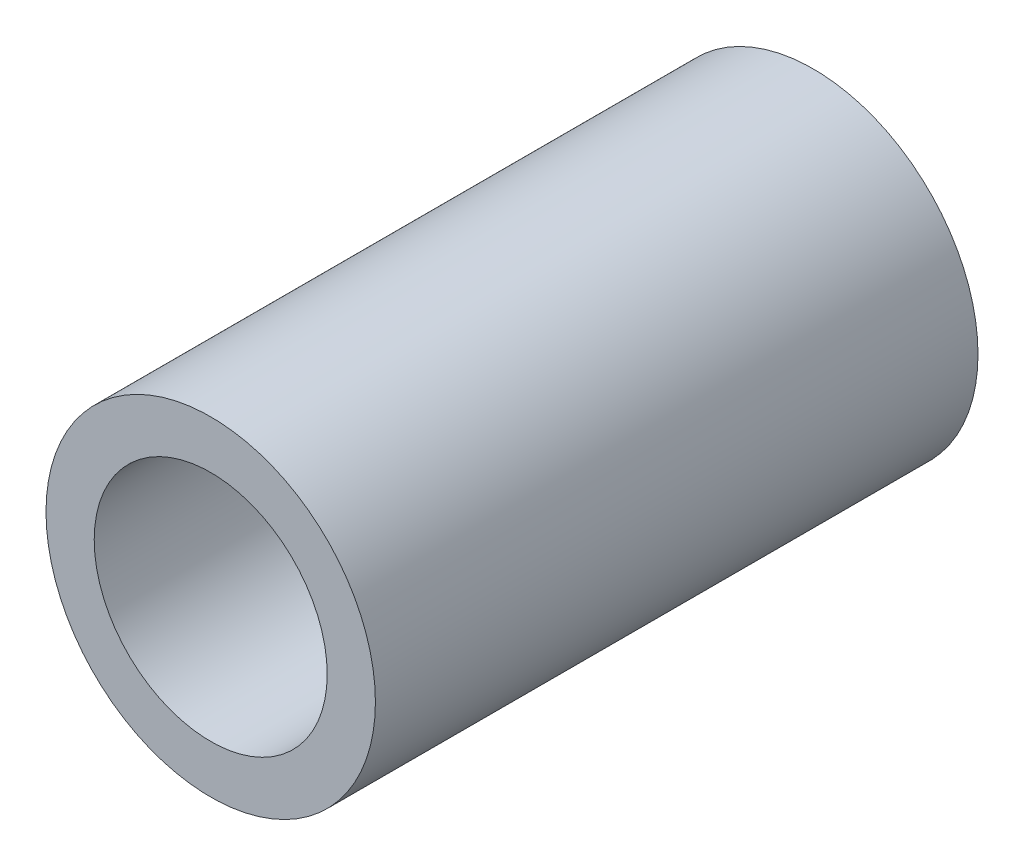
ISO-10303-21;
HEADER;
FILE_DESCRIPTION(('STEP AP214'),'2;1');
FILE_NAME('part.step','',(''),(''),'','','');
FILE_SCHEMA(('AUTOMOTIVE_DESIGN { 1 0 10303 214 1 1 1 1 }'));
ENDSEC;
DATA;
#1=APPLICATION_CONTEXT('core data for automotive mechanical design processes');
#2=APPLICATION_PROTOCOL_DEFINITION('international standard','automotive_design',2000,#1);
#3=PRODUCT_CONTEXT('',#1,'mechanical');
#4=PRODUCT('Part','Part','',(#3));
#5=PRODUCT_RELATED_PRODUCT_CATEGORY('part','',(#4));
#6=PRODUCT_DEFINITION_FORMATION('','',#4);
#7=PRODUCT_DEFINITION_CONTEXT('part definition',#1,'design');
#8=PRODUCT_DEFINITION('design','',#6,#7);
#9=PRODUCT_DEFINITION_SHAPE('','',#8);
#10=(LENGTH_UNIT() NAMED_UNIT(*) SI_UNIT(.MILLI.,.METRE.));
#11=(NAMED_UNIT(*) PLANE_ANGLE_UNIT() SI_UNIT($,.RADIAN.));
#12=(NAMED_UNIT(*) SI_UNIT($,.STERADIAN.) SOLID_ANGLE_UNIT());
#13=UNCERTAINTY_MEASURE_WITH_UNIT(LENGTH_MEASURE(1.E-05),#10,'distance_accuracy_value','');
#14=(GEOMETRIC_REPRESENTATION_CONTEXT(3) GLOBAL_UNCERTAINTY_ASSIGNED_CONTEXT((#13)) GLOBAL_UNIT_ASSIGNED_CONTEXT((#10,
#11,#12)) REPRESENTATION_CONTEXT('',''));
#15=CARTESIAN_POINT('',(0.,0.,0.));
#16=DIRECTION('',(0.,0.,1.));
#17=DIRECTION('',(1.,0.,0.));
#18=AXIS2_PLACEMENT_3D('',#15,#16,#17);
#19=CARTESIAN_POINT('',(0.,0.,7.5));
#20=DIRECTION('',(0.,0.,1.));
#21=DIRECTION('',(1.,0.,0.));
#22=AXIS2_PLACEMENT_3D('',#19,#20,#21);
#23=PLANE('',#22);
#24=CARTESIAN_POINT('',(0.,0.,7.5));
#25=DIRECTION('',(0.,0.,1.));
#26=DIRECTION('',(1.,0.,0.));
#27=AXIS2_PLACEMENT_3D('',#24,#25,#26);
#28=CIRCLE('',#27,2.05);
#29=CARTESIAN_POINT('',(2.05,0.,7.5));
#30=VERTEX_POINT('',#29);
#31=EDGE_CURVE('E10',#30,#30,#28,.T.);
#32=ORIENTED_EDGE('',*,*,#31,.T.);
#33=EDGE_LOOP('',(#32));
#34=FACE_BOUND('',#33,.T.);
#35=CARTESIAN_POINT('',(0.,0.,7.5));
#36=DIRECTION('',(0.,0.,1.));
#37=DIRECTION('',(1.,0.,0.));
#38=AXIS2_PLACEMENT_3D('',#35,#36,#37);
#39=CIRCLE('',#38,1.45);
#40=CARTESIAN_POINT('',(1.45,0.,7.5));
#41=VERTEX_POINT('',#40);
#42=EDGE_CURVE('E42',#41,#41,#39,.T.);
#43=ORIENTED_EDGE('',*,*,#42,.F.);
#44=EDGE_LOOP('',(#43));
#45=FACE_BOUND('',#44,.T.);
#46=ADVANCED_FACE('F31',(#34,#45),#23,.T.);
#47=CARTESIAN_POINT('',(0.,0.,0.));
#48=DIRECTION('',(0.,0.,1.));
#49=DIRECTION('',(1.,0.,0.));
#50=AXIS2_PLACEMENT_3D('',#47,#48,#49);
#51=PLANE('',#50);
#52=CARTESIAN_POINT('',(0.,0.,0.));
#53=DIRECTION('',(0.,0.,1.));
#54=DIRECTION('',(1.,0.,0.));
#55=AXIS2_PLACEMENT_3D('',#52,#53,#54);
#56=CIRCLE('',#55,2.05);
#57=CARTESIAN_POINT('',(2.05,0.,0.));
#58=VERTEX_POINT('',#57);
#59=EDGE_CURVE('E35',#58,#58,#56,.T.);
#60=ORIENTED_EDGE('',*,*,#59,.F.);
#61=EDGE_LOOP('',(#60));
#62=FACE_BOUND('',#61,.T.);
#63=CARTESIAN_POINT('',(0.,0.,0.));
#64=DIRECTION('',(0.,0.,1.));
#65=DIRECTION('',(1.,0.,0.));
#66=AXIS2_PLACEMENT_3D('',#63,#64,#65);
#67=CIRCLE('',#66,1.45);
#68=CARTESIAN_POINT('',(1.45,0.,0.));
#69=VERTEX_POINT('',#68);
#70=EDGE_CURVE('E44',#69,#69,#67,.T.);
#71=ORIENTED_EDGE('',*,*,#70,.T.);
#72=EDGE_LOOP('',(#71));
#73=FACE_BOUND('',#72,.T.);
#74=ADVANCED_FACE('F54',(#62,#73),#51,.F.);
#75=CARTESIAN_POINT('',(0.,0.,7.5));
#76=DIRECTION('',(0.,0.,-1.));
#77=DIRECTION('',(-1.,0.,0.));
#78=AXIS2_PLACEMENT_3D('',#75,#76,#77);
#79=CYLINDRICAL_SURFACE('',#78,2.05);
#80=ORIENTED_EDGE('',*,*,#31,.F.);
#81=EDGE_LOOP('',(#80));
#82=FACE_BOUND('',#81,.T.);
#83=ORIENTED_EDGE('',*,*,#59,.T.);
#84=EDGE_LOOP('',(#83));
#85=FACE_BOUND('',#84,.T.);
#86=ADVANCED_FACE('F33',(#82,#85),#79,.T.);
#87=CARTESIAN_POINT('',(0.,0.,7.5));
#88=DIRECTION('',(0.,0.,-1.));
#89=DIRECTION('',(-1.,0.,0.));
#90=AXIS2_PLACEMENT_3D('',#87,#88,#89);
#91=CYLINDRICAL_SURFACE('',#90,1.45);
#92=ORIENTED_EDGE('',*,*,#42,.T.);
#93=EDGE_LOOP('',(#92));
#94=FACE_BOUND('',#93,.T.);
#95=ORIENTED_EDGE('',*,*,#70,.F.);
#96=EDGE_LOOP('',(#95));
#97=FACE_BOUND('',#96,.T.);
#98=ADVANCED_FACE('F50',(#94,#97),#91,.F.);
#99=CLOSED_SHELL('',(#46,#74,#86,#98));
#100=MANIFOLD_SOLID_BREP('B2',#99);
#101=ADVANCED_BREP_SHAPE_REPRESENTATION('',(#18,#100),#14);
#102=SHAPE_DEFINITION_REPRESENTATION(#9,#101);
ENDSEC;
END-ISO-10303-21;
